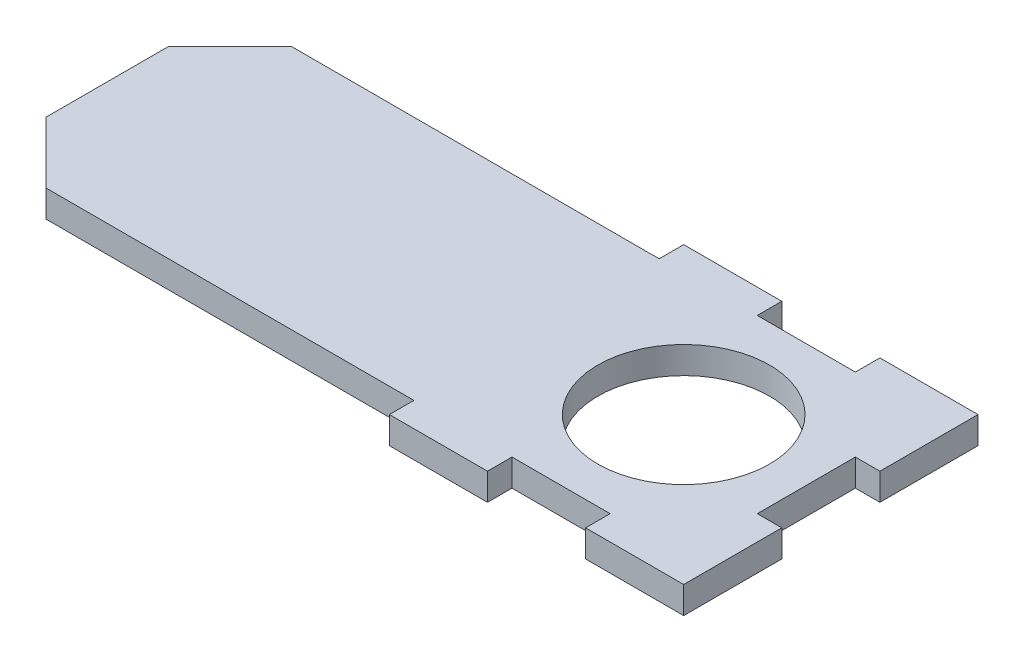
ISO-10303-21;
HEADER;
FILE_DESCRIPTION(('STEP AP214'),'2;1');
FILE_NAME('part.step','',(''),(''),'','','');
FILE_SCHEMA(('AUTOMOTIVE_DESIGN { 1 0 10303 214 1 1 1 1 }'));
ENDSEC;
DATA;
#1=APPLICATION_CONTEXT('core data for automotive mechanical design processes');
#2=APPLICATION_PROTOCOL_DEFINITION('international standard','automotive_design',2000,#1);
#3=PRODUCT_CONTEXT('',#1,'mechanical');
#4=PRODUCT('Part','Part','',(#3));
#5=PRODUCT_RELATED_PRODUCT_CATEGORY('part','',(#4));
#6=PRODUCT_DEFINITION_FORMATION('','',#4);
#7=PRODUCT_DEFINITION_CONTEXT('part definition',#1,'design');
#8=PRODUCT_DEFINITION('design','',#6,#7);
#9=PRODUCT_DEFINITION_SHAPE('','',#8);
#10=(LENGTH_UNIT() NAMED_UNIT(*) SI_UNIT(.MILLI.,.METRE.));
#11=(NAMED_UNIT(*) PLANE_ANGLE_UNIT() SI_UNIT($,.RADIAN.));
#12=(NAMED_UNIT(*) SI_UNIT($,.STERADIAN.) SOLID_ANGLE_UNIT());
#13=UNCERTAINTY_MEASURE_WITH_UNIT(LENGTH_MEASURE(1.E-05),#10,'distance_accuracy_value','');
#14=(GEOMETRIC_REPRESENTATION_CONTEXT(3) GLOBAL_UNCERTAINTY_ASSIGNED_CONTEXT((#13)) GLOBAL_UNIT_ASSIGNED_CONTEXT((#10,
#11,#12)) REPRESENTATION_CONTEXT('',''));
#15=CARTESIAN_POINT('',(0.,0.,0.));
#16=DIRECTION('',(0.,0.,1.));
#17=DIRECTION('',(1.,0.,0.));
#18=AXIS2_PLACEMENT_3D('',#15,#16,#17);
#19=CARTESIAN_POINT('',(-161.731808477122,2.2,0.));
#20=DIRECTION('',(-1.,0.,0.));
#21=DIRECTION('',(0.,0.,1.));
#22=AXIS2_PLACEMENT_3D('',#19,#20,#21);
#23=PLANE('',#22);
#24=DIRECTION('',(0.,0.,-1.));
#25=VECTOR('',#24,1.);
#26=CARTESIAN_POINT('',(-161.731808477122,0.,0.));
#27=LINE('',#26,#25);
#28=CARTESIAN_POINT('',(-161.731808477122,0.,-9.59771271610144));
#29=VERTEX_POINT('',#28);
#30=CARTESIAN_POINT('',(-161.731808477122,0.,-11.5977127156621));
#31=VERTEX_POINT('',#30);
#32=EDGE_CURVE('E270',#29,#31,#27,.T.);
#33=ORIENTED_EDGE('',*,*,#32,.F.);
#34=DIRECTION('',(0.,-1.,0.));
#35=VECTOR('',#34,1.);
#36=CARTESIAN_POINT('',(-161.731808477122,2.2,-9.59771271610144));
#37=LINE('',#36,#35);
#38=CARTESIAN_POINT('',(-161.731808477122,2.2,-9.59771271610144));
#39=VERTEX_POINT('',#38);
#40=EDGE_CURVE('E11',#39,#29,#37,.T.);
#41=ORIENTED_EDGE('',*,*,#40,.F.);
#42=DIRECTION('',(0.,0.,-1.));
#43=VECTOR('',#42,1.);
#44=CARTESIAN_POINT('',(-161.731808477122,2.2,0.));
#45=LINE('',#44,#43);
#46=CARTESIAN_POINT('',(-161.731808477122,2.2,-11.5977127156621));
#47=VERTEX_POINT('',#46);
#48=EDGE_CURVE('E374',#39,#47,#45,.T.);
#49=ORIENTED_EDGE('',*,*,#48,.T.);
#50=DIRECTION('',(0.,-1.,0.));
#51=VECTOR('',#50,1.);
#52=CARTESIAN_POINT('',(-161.731808477122,2.2,-11.5977127156621));
#53=LINE('',#52,#51);
#54=EDGE_CURVE('E130',#47,#31,#53,.T.);
#55=ORIENTED_EDGE('',*,*,#54,.T.);
#56=EDGE_LOOP('',(#33,#41,#49,#55));
#57=FACE_BOUND('',#56,.T.);
#58=ADVANCED_FACE('F37',(#57),#23,.T.);
#59=CARTESIAN_POINT('',(0.,2.2,-9.59771271610144));
#60=DIRECTION('',(0.,0.,-1.));
#61=DIRECTION('',(-1.,0.,0.));
#62=AXIS2_PLACEMENT_3D('',#59,#60,#61);
#63=PLANE('',#62);
#64=DIRECTION('',(1.,0.,0.));
#65=VECTOR('',#64,1.);
#66=CARTESIAN_POINT('',(0.,0.,-9.59771271610144));
#67=LINE('',#66,#65);
#68=CARTESIAN_POINT('',(-191.731808477096,0.,-9.59771271610144));
#69=VERTEX_POINT('',#68);
#70=EDGE_CURVE('E268',#69,#29,#67,.T.);
#71=ORIENTED_EDGE('',*,*,#70,.F.);
#72=DIRECTION('',(0.,-1.,0.));
#73=VECTOR('',#72,1.);
#74=CARTESIAN_POINT('',(-191.731808477096,2.2,-9.59771271610144));
#75=LINE('',#74,#73);
#76=CARTESIAN_POINT('',(-191.731808477096,2.2,-9.59771271610144));
#77=VERTEX_POINT('',#76);
#78=EDGE_CURVE('E46',#77,#69,#75,.T.);
#79=ORIENTED_EDGE('',*,*,#78,.F.);
#80=DIRECTION('',(1.,0.,0.));
#81=VECTOR('',#80,1.);
#82=CARTESIAN_POINT('',(0.,2.2,-9.59771271610144));
#83=LINE('',#82,#81);
#84=EDGE_CURVE('E372',#77,#39,#83,.T.);
#85=ORIENTED_EDGE('',*,*,#84,.T.);
#86=ORIENTED_EDGE('',*,*,#40,.T.);
#87=EDGE_LOOP('',(#71,#79,#85,#86));
#88=FACE_BOUND('',#87,.T.);
#89=ADVANCED_FACE('F269',(#88),#63,.T.);
#90=CARTESIAN_POINT('',(-100.664760596598,2.2,-100.664760596599));
#91=DIRECTION('',(-0.707106781186545,0.,-0.70710678118655));
#92=DIRECTION('',(-0.70710678118655,0.,0.707106781186545));
#93=AXIS2_PLACEMENT_3D('',#90,#91,#92);
#94=PLANE('',#93);
#95=DIRECTION('',(0.70710678118655,0.,-0.707106781186545));
#96=VECTOR('',#95,1.);
#97=CARTESIAN_POINT('',(-100.664760596598,0.,-100.664760596599));
#98=LINE('',#97,#96);
#99=CARTESIAN_POINT('',(-196.731808477118,0.,-4.59771271607949));
#100=VERTEX_POINT('',#99);
#101=EDGE_CURVE('E260',#100,#69,#98,.T.);
#102=ORIENTED_EDGE('',*,*,#101,.F.);
#103=DIRECTION('',(0.,-1.,0.));
#104=VECTOR('',#103,1.);
#105=CARTESIAN_POINT('',(-196.731808477118,2.2,-4.59771271607949));
#106=LINE('',#105,#104);
#107=CARTESIAN_POINT('',(-196.731808477118,2.2,-4.59771271607949));
#108=VERTEX_POINT('',#107);
#109=EDGE_CURVE('E253',#108,#100,#106,.T.);
#110=ORIENTED_EDGE('',*,*,#109,.F.);
#111=DIRECTION('',(0.70710678118655,0.,-0.707106781186545));
#112=VECTOR('',#111,1.);
#113=CARTESIAN_POINT('',(-100.664760596598,2.2,-100.664760596599));
#114=LINE('',#113,#112);
#115=EDGE_CURVE('E263',#108,#77,#114,.T.);
#116=ORIENTED_EDGE('',*,*,#115,.T.);
#117=ORIENTED_EDGE('',*,*,#78,.T.);
#118=EDGE_LOOP('',(#102,#110,#116,#117));
#119=FACE_BOUND('',#118,.T.);
#120=ADVANCED_FACE('F258',(#119),#94,.T.);
#121=CARTESIAN_POINT('',(-196.731808477118,2.2,0.));
#122=DIRECTION('',(-1.,0.,0.));
#123=DIRECTION('',(0.,0.,1.));
#124=AXIS2_PLACEMENT_3D('',#121,#122,#123);
#125=PLANE('',#124);
#126=DIRECTION('',(0.,0.,-1.));
#127=VECTOR('',#126,1.);
#128=CARTESIAN_POINT('',(-196.731808477118,0.,0.));
#129=LINE('',#128,#127);
#130=CARTESIAN_POINT('',(-196.731808477118,0.,5.40228728413635));
#131=VERTEX_POINT('',#130);
#132=EDGE_CURVE('E275',#131,#100,#129,.T.);
#133=ORIENTED_EDGE('',*,*,#132,.F.);
#134=DIRECTION('',(0.,-1.,0.));
#135=VECTOR('',#134,1.);
#136=CARTESIAN_POINT('',(-196.731808477118,2.2,5.40228728413635));
#137=LINE('',#136,#135);
#138=CARTESIAN_POINT('',(-196.731808477118,2.2,5.40228728413635));
#139=VERTEX_POINT('',#138);
#140=EDGE_CURVE('E251',#139,#131,#137,.T.);
#141=ORIENTED_EDGE('',*,*,#140,.F.);
#142=DIRECTION('',(0.,0.,-1.));
#143=VECTOR('',#142,1.);
#144=CARTESIAN_POINT('',(-196.731808477118,2.2,0.));
#145=LINE('',#144,#143);
#146=EDGE_CURVE('E368',#139,#108,#145,.T.);
#147=ORIENTED_EDGE('',*,*,#146,.T.);
#148=ORIENTED_EDGE('',*,*,#109,.T.);
#149=EDGE_LOOP('',(#133,#141,#147,#148));
#150=FACE_BOUND('',#149,.T.);
#151=ADVANCED_FACE('F404',(#150),#125,.T.);
#152=CARTESIAN_POINT('',(-101.067047880627,2.2,101.067047880627));
#153=DIRECTION('',(-0.707106781186547,0.,0.707106781186548));
#154=DIRECTION('',(0.707106781186548,0.,0.707106781186547));
#155=AXIS2_PLACEMENT_3D('',#152,#153,#154);
#156=PLANE('',#155);
#157=DIRECTION('',(-0.707106781186548,0.,-0.707106781186547));
#158=VECTOR('',#157,1.);
#159=CARTESIAN_POINT('',(-101.067047880627,0.,101.067047880627));
#160=LINE('',#159,#158);
#161=CARTESIAN_POINT('',(-191.731808477118,0.,10.4022872841364));
#162=VERTEX_POINT('',#161);
#163=EDGE_CURVE('E277',#162,#131,#160,.T.);
#164=ORIENTED_EDGE('',*,*,#163,.F.);
#165=DIRECTION('',(0.,-1.,0.));
#166=VECTOR('',#165,1.);
#167=CARTESIAN_POINT('',(-191.731808477118,2.2,10.4022872841364));
#168=LINE('',#167,#166);
#169=CARTESIAN_POINT('',(-191.731808477118,2.2,10.4022872841364));
#170=VERTEX_POINT('',#169);
#171=EDGE_CURVE('E249',#170,#162,#168,.T.);
#172=ORIENTED_EDGE('',*,*,#171,.F.);
#173=DIRECTION('',(-0.707106781186548,0.,-0.707106781186547));
#174=VECTOR('',#173,1.);
#175=CARTESIAN_POINT('',(-101.067047880627,2.2,101.067047880627));
#176=LINE('',#175,#174);
#177=EDGE_CURVE('E363',#170,#139,#176,.T.);
#178=ORIENTED_EDGE('',*,*,#177,.T.);
#179=ORIENTED_EDGE('',*,*,#140,.T.);
#180=EDGE_LOOP('',(#164,#172,#178,#179));
#181=FACE_BOUND('',#180,.T.);
#182=ADVANCED_FACE('F407',(#181),#156,.T.);
#183=CARTESIAN_POINT('',(0.,2.2,10.4022872841364));
#184=DIRECTION('',(0.,0.,-1.));
#185=DIRECTION('',(-1.,0.,0.));
#186=AXIS2_PLACEMENT_3D('',#183,#184,#185);
#187=PLANE('',#186);
#188=DIRECTION('',(1.,0.,0.));
#189=VECTOR('',#188,1.);
#190=CARTESIAN_POINT('',(0.,0.,10.4022872841364));
#191=LINE('',#190,#189);
#192=CARTESIAN_POINT('',(-161.731808477122,0.,10.4022872841364));
#193=VERTEX_POINT('',#192);
#194=EDGE_CURVE('E282',#162,#193,#191,.T.);
#195=ORIENTED_EDGE('',*,*,#194,.T.);
#196=DIRECTION('',(0.,-1.,0.));
#197=VECTOR('',#196,1.);
#198=CARTESIAN_POINT('',(-161.731808477122,2.2,10.4022872841364));
#199=LINE('',#198,#197);
#200=CARTESIAN_POINT('',(-161.731808477122,2.2,10.4022872841364));
#201=VERTEX_POINT('',#200);
#202=EDGE_CURVE('E247',#201,#193,#199,.T.);
#203=ORIENTED_EDGE('',*,*,#202,.F.);
#204=DIRECTION('',(1.,0.,0.));
#205=VECTOR('',#204,1.);
#206=CARTESIAN_POINT('',(0.,2.2,10.4022872841364));
#207=LINE('',#206,#205);
#208=EDGE_CURVE('E360',#170,#201,#207,.T.);
#209=ORIENTED_EDGE('',*,*,#208,.F.);
#210=ORIENTED_EDGE('',*,*,#171,.T.);
#211=EDGE_LOOP('',(#195,#203,#209,#210));
#212=FACE_BOUND('',#211,.T.);
#213=ADVANCED_FACE('F411',(#212),#187,.F.);
#214=CARTESIAN_POINT('',(-161.731808477122,2.2,0.));
#215=DIRECTION('',(-1.,0.,0.));
#216=DIRECTION('',(0.,0.,1.));
#217=AXIS2_PLACEMENT_3D('',#214,#215,#216);
#218=PLANE('',#217);
#219=DIRECTION('',(0.,0.,-1.));
#220=VECTOR('',#219,1.);
#221=CARTESIAN_POINT('',(-161.731808477122,0.,0.));
#222=LINE('',#221,#220);
#223=CARTESIAN_POINT('',(-161.731808477122,0.,12.4022872843402));
#224=VERTEX_POINT('',#223);
#225=EDGE_CURVE('E285',#224,#193,#222,.T.);
#226=ORIENTED_EDGE('',*,*,#225,.F.);
#227=DIRECTION('',(0.,-1.,0.));
#228=VECTOR('',#227,1.);
#229=CARTESIAN_POINT('',(-161.731808477122,2.2,12.4022872843402));
#230=LINE('',#229,#228);
#231=CARTESIAN_POINT('',(-161.731808477122,2.2,12.4022872843402));
#232=VERTEX_POINT('',#231);
#233=EDGE_CURVE('E245',#232,#224,#230,.T.);
#234=ORIENTED_EDGE('',*,*,#233,.F.);
#235=DIRECTION('',(0.,0.,-1.));
#236=VECTOR('',#235,1.);
#237=CARTESIAN_POINT('',(-161.731808477122,2.2,0.));
#238=LINE('',#237,#236);
#239=EDGE_CURVE('E355',#232,#201,#238,.T.);
#240=ORIENTED_EDGE('',*,*,#239,.T.);
#241=ORIENTED_EDGE('',*,*,#202,.T.);
#242=EDGE_LOOP('',(#226,#234,#240,#241));
#243=FACE_BOUND('',#242,.T.);
#244=ADVANCED_FACE('F415',(#243),#218,.T.);
#245=CARTESIAN_POINT('',(0.,2.2,12.4022872843402));
#246=DIRECTION('',(0.,0.,1.));
#247=DIRECTION('',(1.,0.,0.));
#248=AXIS2_PLACEMENT_3D('',#245,#246,#247);
#249=PLANE('',#248);
#250=DIRECTION('',(-1.,0.,0.));
#251=VECTOR('',#250,1.);
#252=CARTESIAN_POINT('',(0.,0.,12.4022872843402));
#253=LINE('',#252,#251);
#254=CARTESIAN_POINT('',(-153.731808477115,0.,12.4022872843402));
#255=VERTEX_POINT('',#254);
#256=EDGE_CURVE('E288',#255,#224,#253,.T.);
#257=ORIENTED_EDGE('',*,*,#256,.F.);
#258=DIRECTION('',(0.,-1.,0.));
#259=VECTOR('',#258,1.);
#260=CARTESIAN_POINT('',(-153.731808477115,2.2,12.4022872843402));
#261=LINE('',#260,#259);
#262=CARTESIAN_POINT('',(-153.731808477115,2.2,12.4022872843402));
#263=VERTEX_POINT('',#262);
#264=EDGE_CURVE('E243',#263,#255,#261,.T.);
#265=ORIENTED_EDGE('',*,*,#264,.F.);
#266=DIRECTION('',(-1.,0.,0.));
#267=VECTOR('',#266,1.);
#268=CARTESIAN_POINT('',(0.,2.2,12.4022872843402));
#269=LINE('',#268,#267);
#270=EDGE_CURVE('E347',#263,#232,#269,.T.);
#271=ORIENTED_EDGE('',*,*,#270,.T.);
#272=ORIENTED_EDGE('',*,*,#233,.T.);
#273=EDGE_LOOP('',(#257,#265,#271,#272));
#274=FACE_BOUND('',#273,.T.);
#275=ADVANCED_FACE('F419',(#274),#249,.T.);
#276=CARTESIAN_POINT('',(-153.731808477115,2.2,-4.266914834714E-12));
#277=DIRECTION('',(1.,0.,0.));
#278=DIRECTION('',(0.,0.,-1.));
#279=AXIS2_PLACEMENT_3D('',#276,#277,#278);
#280=PLANE('',#279);
#281=DIRECTION('',(0.,0.,1.));
#282=VECTOR('',#281,1.);
#283=CARTESIAN_POINT('',(-153.731808477115,0.,-4.266914834714E-12));
#284=LINE('',#283,#282);
#285=CARTESIAN_POINT('',(-153.731808477115,0.,10.4022872843314));
#286=VERTEX_POINT('',#285);
#287=EDGE_CURVE('E291',#286,#255,#284,.T.);
#288=ORIENTED_EDGE('',*,*,#287,.F.);
#289=DIRECTION('',(0.,-1.,0.));
#290=VECTOR('',#289,1.);
#291=CARTESIAN_POINT('',(-153.731808477115,2.2,10.4022872843314));
#292=LINE('',#291,#290);
#293=CARTESIAN_POINT('',(-153.731808477115,2.2,10.4022872843314));
#294=VERTEX_POINT('',#293);
#295=EDGE_CURVE('E241',#294,#286,#292,.T.);
#296=ORIENTED_EDGE('',*,*,#295,.F.);
#297=DIRECTION('',(0.,0.,1.));
#298=VECTOR('',#297,1.);
#299=CARTESIAN_POINT('',(-153.731808477115,2.2,-4.266914834714E-12));
#300=LINE('',#299,#298);
#301=EDGE_CURVE('E354',#294,#263,#300,.T.);
#302=ORIENTED_EDGE('',*,*,#301,.T.);
#303=ORIENTED_EDGE('',*,*,#264,.T.);
#304=EDGE_LOOP('',(#288,#296,#302,#303));
#305=FACE_BOUND('',#304,.T.);
#306=ADVANCED_FACE('F420',(#305),#280,.T.);
#307=CARTESIAN_POINT('',(-1.44360735647907E-13,2.2,10.4022872843335));
#308=DIRECTION('',(0.,0.,1.));
#309=DIRECTION('',(1.,0.,0.));
#310=AXIS2_PLACEMENT_3D('',#307,#308,#309);
#311=PLANE('',#310);
#312=DIRECTION('',(-1.,0.,0.));
#313=VECTOR('',#312,1.);
#314=CARTESIAN_POINT('',(-1.44360735647907E-13,0.,10.4022872843335));
#315=LINE('',#314,#313);
#316=CARTESIAN_POINT('',(-145.731808477115,0.,10.4022872843315));
#317=VERTEX_POINT('',#316);
#318=EDGE_CURVE('E295',#317,#286,#315,.T.);
#319=ORIENTED_EDGE('',*,*,#318,.F.);
#320=DIRECTION('',(0.,-1.,0.));
#321=VECTOR('',#320,1.);
#322=CARTESIAN_POINT('',(-145.731808477115,2.2,10.4022872843315));
#323=LINE('',#322,#321);
#324=CARTESIAN_POINT('',(-145.731808477115,2.2,10.4022872843315));
#325=VERTEX_POINT('',#324);
#326=EDGE_CURVE('E239',#325,#317,#323,.T.);
#327=ORIENTED_EDGE('',*,*,#326,.F.);
#328=DIRECTION('',(-1.,0.,0.));
#329=VECTOR('',#328,1.);
#330=CARTESIAN_POINT('',(-1.44360735647907E-13,2.2,10.4022872843335));
#331=LINE('',#330,#329);
#332=EDGE_CURVE('E350',#325,#294,#331,.T.);
#333=ORIENTED_EDGE('',*,*,#332,.T.);
#334=ORIENTED_EDGE('',*,*,#295,.T.);
#335=EDGE_LOOP('',(#319,#327,#333,#334));
#336=FACE_BOUND('',#335,.T.);
#337=ADVANCED_FACE('F423',(#336),#311,.T.);
#338=CARTESIAN_POINT('',(-145.731808477115,2.2,-4.04487022978891E-12));
#339=DIRECTION('',(-1.,0.,0.));
#340=DIRECTION('',(0.,0.,1.));
#341=AXIS2_PLACEMENT_3D('',#338,#339,#340);
#342=PLANE('',#341);
#343=DIRECTION('',(0.,0.,-1.));
#344=VECTOR('',#343,1.);
#345=CARTESIAN_POINT('',(-145.731808477115,0.,-4.04487022978891E-12));
#346=LINE('',#345,#344);
#347=CARTESIAN_POINT('',(-145.731808477115,0.,12.4022872843402));
#348=VERTEX_POINT('',#347);
#349=EDGE_CURVE('E298',#348,#317,#346,.T.);
#350=ORIENTED_EDGE('',*,*,#349,.F.);
#351=DIRECTION('',(0.,-1.,0.));
#352=VECTOR('',#351,1.);
#353=CARTESIAN_POINT('',(-145.731808477115,2.2,12.4022872843402));
#354=LINE('',#353,#352);
#355=CARTESIAN_POINT('',(-145.731808477115,2.2,12.4022872843402));
#356=VERTEX_POINT('',#355);
#357=EDGE_CURVE('E237',#356,#348,#354,.T.);
#358=ORIENTED_EDGE('',*,*,#357,.F.);
#359=DIRECTION('',(0.,0.,-1.));
#360=VECTOR('',#359,1.);
#361=CARTESIAN_POINT('',(-145.731808477115,2.2,-4.04487022978891E-12));
#362=LINE('',#361,#360);
#363=EDGE_CURVE('E345',#356,#325,#362,.T.);
#364=ORIENTED_EDGE('',*,*,#363,.T.);
#365=ORIENTED_EDGE('',*,*,#326,.T.);
#366=EDGE_LOOP('',(#350,#358,#364,#365));
#367=FACE_BOUND('',#366,.T.);
#368=ADVANCED_FACE('F427',(#367),#342,.T.);
#369=CARTESIAN_POINT('',(-137.731808477107,0.,12.4022872843402));
#370=VERTEX_POINT('',#369);
#371=EDGE_CURVE('E292',#370,#348,#253,.T.);
#372=ORIENTED_EDGE('',*,*,#371,.F.);
#373=DIRECTION('',(0.,-1.,0.));
#374=VECTOR('',#373,1.);
#375=CARTESIAN_POINT('',(-137.731808477107,2.2,12.4022872843402));
#376=LINE('',#375,#374);
#377=CARTESIAN_POINT('',(-137.731808477107,2.2,12.4022872843402));
#378=VERTEX_POINT('',#377);
#379=EDGE_CURVE('E235',#378,#370,#376,.T.);
#380=ORIENTED_EDGE('',*,*,#379,.F.);
#381=EDGE_CURVE('E339',#378,#356,#269,.T.);
#382=ORIENTED_EDGE('',*,*,#381,.T.);
#383=ORIENTED_EDGE('',*,*,#357,.T.);
#384=EDGE_LOOP('',(#372,#380,#382,#383));
#385=FACE_BOUND('',#384,.T.);
#386=ADVANCED_FACE('F431',(#385),#249,.T.);
#387=CARTESIAN_POINT('',(-137.731808477107,2.2,0.));
#388=DIRECTION('',(-1.,0.,0.));
#389=DIRECTION('',(0.,0.,1.));
#390=AXIS2_PLACEMENT_3D('',#387,#388,#389);
#391=PLANE('',#390);
#392=DIRECTION('',(0.,0.,-1.));
#393=VECTOR('',#392,1.);
#394=CARTESIAN_POINT('',(-137.731808477107,0.,0.));
#395=LINE('',#394,#393);
#396=CARTESIAN_POINT('',(-137.731808477107,0.,4.40228728433163));
#397=VERTEX_POINT('',#396);
#398=EDGE_CURVE('E301',#370,#397,#395,.T.);
#399=ORIENTED_EDGE('',*,*,#398,.T.);
#400=DIRECTION('',(0.,-1.,0.));
#401=VECTOR('',#400,1.);
#402=CARTESIAN_POINT('',(-137.731808477107,2.2,4.40228728433163));
#403=LINE('',#402,#401);
#404=CARTESIAN_POINT('',(-137.731808477107,2.2,4.40228728433163));
#405=VERTEX_POINT('',#404);
#406=EDGE_CURVE('E232',#405,#397,#403,.T.);
#407=ORIENTED_EDGE('',*,*,#406,.F.);
#408=DIRECTION('',(0.,0.,-1.));
#409=VECTOR('',#408,1.);
#410=CARTESIAN_POINT('',(-137.731808477107,2.2,0.));
#411=LINE('',#410,#409);
#412=EDGE_CURVE('E331',#378,#405,#411,.T.);
#413=ORIENTED_EDGE('',*,*,#412,.F.);
#414=ORIENTED_EDGE('',*,*,#379,.T.);
#415=EDGE_LOOP('',(#399,#407,#413,#414));
#416=FACE_BOUND('',#415,.T.);
#417=ADVANCED_FACE('F435',(#416),#391,.F.);
#418=CARTESIAN_POINT('',(-1.22188017602098E-13,2.2,4.40228728433546));
#419=DIRECTION('',(0.,0.,1.));
#420=DIRECTION('',(1.,0.,0.));
#421=AXIS2_PLACEMENT_3D('',#418,#419,#420);
#422=PLANE('',#421);
#423=DIRECTION('',(-1.,0.,0.));
#424=VECTOR('',#423,1.);
#425=CARTESIAN_POINT('',(-1.22188017602098E-13,0.,4.40228728433546));
#426=LINE('',#425,#424);
#427=CARTESIAN_POINT('',(-139.731808477115,0.,4.40228728433158));
#428=VERTEX_POINT('',#427);
#429=EDGE_CURVE('E304',#397,#428,#426,.T.);
#430=ORIENTED_EDGE('',*,*,#429,.T.);
#431=DIRECTION('',(0.,-1.,0.));
#432=VECTOR('',#431,1.);
#433=CARTESIAN_POINT('',(-139.731808477115,2.2,4.40228728433158));
#434=LINE('',#433,#432);
#435=CARTESIAN_POINT('',(-139.731808477115,2.2,4.40228728433158));
#436=VERTEX_POINT('',#435);
#437=EDGE_CURVE('E229',#436,#428,#434,.T.);
#438=ORIENTED_EDGE('',*,*,#437,.F.);
#439=DIRECTION('',(-1.,0.,0.));
#440=VECTOR('',#439,1.);
#441=CARTESIAN_POINT('',(-1.22188017602098E-13,2.2,4.40228728433546));
#442=LINE('',#441,#440);
#443=EDGE_CURVE('E338',#405,#436,#442,.T.);
#444=ORIENTED_EDGE('',*,*,#443,.F.);
#445=ORIENTED_EDGE('',*,*,#406,.T.);
#446=EDGE_LOOP('',(#430,#438,#444,#445));
#447=FACE_BOUND('',#446,.T.);
#448=ADVANCED_FACE('F436',(#447),#422,.F.);
#449=CARTESIAN_POINT('',(-139.731808477115,2.2,-1.93916838804757E-12));
#450=DIRECTION('',(-1.,0.,0.));
#451=DIRECTION('',(0.,0.,1.));
#452=AXIS2_PLACEMENT_3D('',#449,#450,#451);
#453=PLANE('',#452);
#454=DIRECTION('',(0.,0.,-1.));
#455=VECTOR('',#454,1.);
#456=CARTESIAN_POINT('',(-139.731808477115,0.,-1.93916838804757E-12));
#457=LINE('',#456,#455);
#458=CARTESIAN_POINT('',(-139.731808477115,0.,-3.59771271566843));
#459=VERTEX_POINT('',#458);
#460=EDGE_CURVE('E308',#428,#459,#457,.T.);
#461=ORIENTED_EDGE('',*,*,#460,.T.);
#462=DIRECTION('',(0.,-1.,0.));
#463=VECTOR('',#462,1.);
#464=CARTESIAN_POINT('',(-139.731808477115,2.2,-3.59771271566843));
#465=LINE('',#464,#463);
#466=CARTESIAN_POINT('',(-139.731808477115,2.2,-3.59771271566843));
#467=VERTEX_POINT('',#466);
#468=EDGE_CURVE('E226',#467,#459,#465,.T.);
#469=ORIENTED_EDGE('',*,*,#468,.F.);
#470=DIRECTION('',(0.,0.,-1.));
#471=VECTOR('',#470,1.);
#472=CARTESIAN_POINT('',(-139.731808477115,2.2,-1.93916838804757E-12));
#473=LINE('',#472,#471);
#474=EDGE_CURVE('E334',#436,#467,#473,.T.);
#475=ORIENTED_EDGE('',*,*,#474,.F.);
#476=ORIENTED_EDGE('',*,*,#437,.T.);
#477=EDGE_LOOP('',(#461,#469,#475,#476));
#478=FACE_BOUND('',#477,.T.);
#479=ADVANCED_FACE('F439',(#478),#453,.F.);
#480=CARTESIAN_POINT('',(0.,2.2,-3.59771271566843));
#481=DIRECTION('',(0.,0.,-1.));
#482=DIRECTION('',(-1.,0.,0.));
#483=AXIS2_PLACEMENT_3D('',#480,#481,#482);
#484=PLANE('',#483);
#485=DIRECTION('',(1.,0.,0.));
#486=VECTOR('',#485,1.);
#487=CARTESIAN_POINT('',(0.,0.,-3.59771271566843));
#488=LINE('',#487,#486);
#489=CARTESIAN_POINT('',(-137.731808477107,0.,-3.59771271566843));
#490=VERTEX_POINT('',#489);
#491=EDGE_CURVE('E311',#459,#490,#488,.T.);
#492=ORIENTED_EDGE('',*,*,#491,.T.);
#493=DIRECTION('',(0.,-1.,0.));
#494=VECTOR('',#493,1.);
#495=CARTESIAN_POINT('',(-137.731808477107,2.2,-3.59771271566843));
#496=LINE('',#495,#494);
#497=CARTESIAN_POINT('',(-137.731808477107,2.2,-3.59771271566843));
#498=VERTEX_POINT('',#497);
#499=EDGE_CURVE('E223',#498,#490,#496,.T.);
#500=ORIENTED_EDGE('',*,*,#499,.F.);
#501=DIRECTION('',(1.,0.,0.));
#502=VECTOR('',#501,1.);
#503=CARTESIAN_POINT('',(0.,2.2,-3.59771271566843));
#504=LINE('',#503,#502);
#505=EDGE_CURVE('E329',#467,#498,#504,.T.);
#506=ORIENTED_EDGE('',*,*,#505,.F.);
#507=ORIENTED_EDGE('',*,*,#468,.T.);
#508=EDGE_LOOP('',(#492,#500,#506,#507));
#509=FACE_BOUND('',#508,.T.);
#510=ADVANCED_FACE('F443',(#509),#484,.F.);
#511=CARTESIAN_POINT('',(-137.731808477107,0.,-11.5977127156621));
#512=VERTEX_POINT('',#511);
#513=EDGE_CURVE('E305',#490,#512,#395,.T.);
#514=ORIENTED_EDGE('',*,*,#513,.T.);
#515=DIRECTION('',(0.,-1.,0.));
#516=VECTOR('',#515,1.);
#517=CARTESIAN_POINT('',(-137.731808477107,2.2,-11.5977127156621));
#518=LINE('',#517,#516);
#519=CARTESIAN_POINT('',(-137.731808477107,2.2,-11.5977127156621));
#520=VERTEX_POINT('',#519);
#521=EDGE_CURVE('E220',#520,#512,#518,.T.);
#522=ORIENTED_EDGE('',*,*,#521,.F.);
#523=EDGE_CURVE('E326',#498,#520,#411,.T.);
#524=ORIENTED_EDGE('',*,*,#523,.F.);
#525=ORIENTED_EDGE('',*,*,#499,.T.);
#526=EDGE_LOOP('',(#514,#522,#524,#525));
#527=FACE_BOUND('',#526,.T.);
#528=ADVANCED_FACE('F447',(#527),#391,.F.);
#529=CARTESIAN_POINT('',(0.,2.2,-11.5977127156621));
#530=DIRECTION('',(0.,0.,1.));
#531=DIRECTION('',(1.,0.,0.));
#532=AXIS2_PLACEMENT_3D('',#529,#530,#531);
#533=PLANE('',#532);
#534=DIRECTION('',(-1.,0.,0.));
#535=VECTOR('',#534,1.);
#536=CARTESIAN_POINT('',(0.,0.,-11.5977127156621));
#537=LINE('',#536,#535);
#538=CARTESIAN_POINT('',(-145.731808477115,0.,-11.5977127156621));
#539=VERTEX_POINT('',#538);
#540=EDGE_CURVE('E314',#512,#539,#537,.T.);
#541=ORIENTED_EDGE('',*,*,#540,.T.);
#542=DIRECTION('',(0.,-1.,0.));
#543=VECTOR('',#542,1.);
#544=CARTESIAN_POINT('',(-145.731808477115,2.2,-11.5977127156621));
#545=LINE('',#544,#543);
#546=CARTESIAN_POINT('',(-145.731808477115,2.2,-11.5977127156621));
#547=VERTEX_POINT('',#546);
#548=EDGE_CURVE('E213',#547,#539,#545,.T.);
#549=ORIENTED_EDGE('',*,*,#548,.F.);
#550=DIRECTION('',(-1.,0.,0.));
#551=VECTOR('',#550,1.);
#552=CARTESIAN_POINT('',(0.,2.2,-11.5977127156621));
#553=LINE('',#552,#551);
#554=EDGE_CURVE('E323',#520,#547,#553,.T.);
#555=ORIENTED_EDGE('',*,*,#554,.F.);
#556=ORIENTED_EDGE('',*,*,#521,.T.);
#557=EDGE_LOOP('',(#541,#549,#555,#556));
#558=FACE_BOUND('',#557,.T.);
#559=ADVANCED_FACE('F394',(#558),#533,.F.);
#560=CARTESIAN_POINT('',(-145.731808477115,2.2,0.));
#561=DIRECTION('',(1.,0.,0.));
#562=DIRECTION('',(0.,0.,-1.));
#563=AXIS2_PLACEMENT_3D('',#560,#561,#562);
#564=PLANE('',#563);
#565=DIRECTION('',(0.,0.,1.));
#566=VECTOR('',#565,1.);
#567=CARTESIAN_POINT('',(-145.731808477115,0.,0.));
#568=LINE('',#567,#566);
#569=CARTESIAN_POINT('',(-145.731808477115,0.,-9.59771271566855));
#570=VERTEX_POINT('',#569);
#571=EDGE_CURVE('E317',#539,#570,#568,.T.);
#572=ORIENTED_EDGE('',*,*,#571,.T.);
#573=DIRECTION('',(0.,-1.,0.));
#574=VECTOR('',#573,1.);
#575=CARTESIAN_POINT('',(-145.731808477115,2.2,-9.59771271566855));
#576=LINE('',#575,#574);
#577=CARTESIAN_POINT('',(-145.731808477115,2.2,-9.59771271566855));
#578=VERTEX_POINT('',#577);
#579=EDGE_CURVE('E211',#578,#570,#576,.T.);
#580=ORIENTED_EDGE('',*,*,#579,.F.);
#581=DIRECTION('',(0.,0.,1.));
#582=VECTOR('',#581,1.);
#583=CARTESIAN_POINT('',(-145.731808477115,2.2,0.));
#584=LINE('',#583,#582);
#585=EDGE_CURVE('E204',#547,#578,#584,.T.);
#586=ORIENTED_EDGE('',*,*,#585,.F.);
#587=ORIENTED_EDGE('',*,*,#548,.T.);
#588=EDGE_LOOP('',(#572,#580,#586,#587));
#589=FACE_BOUND('',#588,.T.);
#590=ADVANCED_FACE('F452',(#589),#564,.F.);
#591=CARTESIAN_POINT('',(1.33195020508383E-13,2.2,-9.59771271566652));
#592=DIRECTION('',(0.,0.,1.));
#593=DIRECTION('',(1.,0.,0.));
#594=AXIS2_PLACEMENT_3D('',#591,#592,#593);
#595=PLANE('',#594);
#596=DIRECTION('',(-1.,0.,0.));
#597=VECTOR('',#596,1.);
#598=CARTESIAN_POINT('',(1.33195020508383E-13,0.,-9.59771271566652));
#599=LINE('',#598,#597);
#600=CARTESIAN_POINT('',(-153.731808477115,0.,-9.59771271566866));
#601=VERTEX_POINT('',#600);
#602=EDGE_CURVE('E210',#570,#601,#599,.T.);
#603=ORIENTED_EDGE('',*,*,#602,.T.);
#604=DIRECTION('',(0.,-1.,0.));
#605=VECTOR('',#604,1.);
#606=CARTESIAN_POINT('',(-153.731808477115,2.2,-9.59771271566866));
#607=LINE('',#606,#605);
#608=CARTESIAN_POINT('',(-153.731808477115,2.2,-9.59771271566866));
#609=VERTEX_POINT('',#608);
#610=EDGE_CURVE('E196',#609,#601,#607,.T.);
#611=ORIENTED_EDGE('',*,*,#610,.F.);
#612=DIRECTION('',(-1.,0.,0.));
#613=VECTOR('',#612,1.);
#614=CARTESIAN_POINT('',(1.33195020508383E-13,2.2,-9.59771271566652));
#615=LINE('',#614,#613);
#616=EDGE_CURVE('E199',#578,#609,#615,.T.);
#617=ORIENTED_EDGE('',*,*,#616,.F.);
#618=ORIENTED_EDGE('',*,*,#579,.T.);
#619=EDGE_LOOP('',(#603,#611,#617,#618));
#620=FACE_BOUND('',#619,.T.);
#621=ADVANCED_FACE('F209',(#620),#595,.F.);
#622=CARTESIAN_POINT('',(-153.731808477115,2.2,0.));
#623=DIRECTION('',(-1.,0.,0.));
#624=DIRECTION('',(0.,0.,1.));
#625=AXIS2_PLACEMENT_3D('',#622,#623,#624);
#626=PLANE('',#625);
#627=DIRECTION('',(0.,0.,-1.));
#628=VECTOR('',#627,1.);
#629=CARTESIAN_POINT('',(-153.731808477115,0.,0.));
#630=LINE('',#629,#628);
#631=CARTESIAN_POINT('',(-153.731808477115,0.,-11.5977127156621));
#632=VERTEX_POINT('',#631);
#633=EDGE_CURVE('E321',#601,#632,#630,.T.);
#634=ORIENTED_EDGE('',*,*,#633,.T.);
#635=DIRECTION('',(0.,-1.,0.));
#636=VECTOR('',#635,1.);
#637=CARTESIAN_POINT('',(-153.731808477115,2.2,-11.5977127156621));
#638=LINE('',#637,#636);
#639=CARTESIAN_POINT('',(-153.731808477115,2.2,-11.5977127156621));
#640=VERTEX_POINT('',#639);
#641=EDGE_CURVE('E198',#640,#632,#638,.T.);
#642=ORIENTED_EDGE('',*,*,#641,.F.);
#643=DIRECTION('',(0.,0.,-1.));
#644=VECTOR('',#643,1.);
#645=CARTESIAN_POINT('',(-153.731808477115,2.2,0.));
#646=LINE('',#645,#644);
#647=EDGE_CURVE('E191',#609,#640,#646,.T.);
#648=ORIENTED_EDGE('',*,*,#647,.F.);
#649=ORIENTED_EDGE('',*,*,#610,.T.);
#650=EDGE_LOOP('',(#634,#642,#648,#649));
#651=FACE_BOUND('',#650,.T.);
#652=ADVANCED_FACE('F194',(#651),#626,.F.);
#653=CARTESIAN_POINT('',(-149.731808477125,2.2,0.402287284341121));
#654=DIRECTION('',(0.,-1.,0.));
#655=DIRECTION('',(0.,0.,-1.));
#656=AXIS2_PLACEMENT_3D('',#653,#654,#655);
#657=CYLINDRICAL_SURFACE('',#656,7.00000000000004);
#658=CARTESIAN_POINT('',(-149.731808477125,2.2,0.402287284341121));
#659=DIRECTION('',(0.,1.,0.));
#660=DIRECTION('',(0.,0.,1.));
#661=AXIS2_PLACEMENT_3D('',#658,#659,#660);
#662=CIRCLE('',#661,7.00000000000004);
#663=CARTESIAN_POINT('',(-149.731808477125,2.2,7.40228728434116));
#664=VERTEX_POINT('',#663);
#665=EDGE_CURVE('E376',#664,#664,#662,.T.);
#666=ORIENTED_EDGE('',*,*,#665,.T.);
#667=EDGE_LOOP('',(#666));
#668=FACE_BOUND('',#667,.T.);
#669=CARTESIAN_POINT('',(-149.731808477125,0.,0.402287284341121));
#670=DIRECTION('',(0.,1.,0.));
#671=DIRECTION('',(0.,0.,1.));
#672=AXIS2_PLACEMENT_3D('',#669,#670,#671);
#673=CIRCLE('',#672,7.00000000000004);
#674=CARTESIAN_POINT('',(-149.731808477125,0.,7.40228728434116));
#675=VERTEX_POINT('',#674);
#676=EDGE_CURVE('E382',#675,#675,#673,.T.);
#677=ORIENTED_EDGE('',*,*,#676,.F.);
#678=EDGE_LOOP('',(#677));
#679=FACE_BOUND('',#678,.T.);
#680=ADVANCED_FACE('F39',(#668,#679),#657,.F.);
#681=EDGE_CURVE('E123',#632,#31,#537,.T.);
#682=ORIENTED_EDGE('',*,*,#681,.T.);
#683=ORIENTED_EDGE('',*,*,#54,.F.);
#684=EDGE_CURVE('E54',#640,#47,#553,.T.);
#685=ORIENTED_EDGE('',*,*,#684,.F.);
#686=ORIENTED_EDGE('',*,*,#641,.T.);
#687=EDGE_LOOP('',(#682,#683,#685,#686));
#688=FACE_BOUND('',#687,.T.);
#689=ADVANCED_FACE('F381',(#688),#533,.F.);
#690=CARTESIAN_POINT('',(0.,2.2,0.));
#691=DIRECTION('',(0.,1.,0.));
#692=DIRECTION('',(0.,0.,1.));
#693=AXIS2_PLACEMENT_3D('',#690,#691,#692);
#694=PLANE('',#693);
#695=ORIENTED_EDGE('',*,*,#665,.F.);
#696=EDGE_LOOP('',(#695));
#697=FACE_BOUND('',#696,.T.);
#698=ORIENTED_EDGE('',*,*,#48,.F.);
#699=ORIENTED_EDGE('',*,*,#84,.F.);
#700=ORIENTED_EDGE('',*,*,#115,.F.);
#701=ORIENTED_EDGE('',*,*,#146,.F.);
#702=ORIENTED_EDGE('',*,*,#177,.F.);
#703=ORIENTED_EDGE('',*,*,#208,.T.);
#704=ORIENTED_EDGE('',*,*,#239,.F.);
#705=ORIENTED_EDGE('',*,*,#270,.F.);
#706=ORIENTED_EDGE('',*,*,#301,.F.);
#707=ORIENTED_EDGE('',*,*,#332,.F.);
#708=ORIENTED_EDGE('',*,*,#363,.F.);
#709=ORIENTED_EDGE('',*,*,#381,.F.);
#710=ORIENTED_EDGE('',*,*,#412,.T.);
#711=ORIENTED_EDGE('',*,*,#443,.T.);
#712=ORIENTED_EDGE('',*,*,#474,.T.);
#713=ORIENTED_EDGE('',*,*,#505,.T.);
#714=ORIENTED_EDGE('',*,*,#523,.T.);
#715=ORIENTED_EDGE('',*,*,#554,.T.);
#716=ORIENTED_EDGE('',*,*,#585,.T.);
#717=ORIENTED_EDGE('',*,*,#616,.T.);
#718=ORIENTED_EDGE('',*,*,#647,.T.);
#719=ORIENTED_EDGE('',*,*,#684,.T.);
#720=EDGE_LOOP('',(#698,#699,#700,#701,#702,#703,#704,#705,#706,#707,#708,#709,#710,#711,#712,
#713,#714,#715,#716,#717,#718,#719));
#721=FACE_BOUND('',#720,.T.);
#722=ADVANCED_FACE('F202',(#697,#721),#694,.T.);
#723=CARTESIAN_POINT('',(0.,0.,0.));
#724=DIRECTION('',(0.,1.,0.));
#725=DIRECTION('',(0.,0.,1.));
#726=AXIS2_PLACEMENT_3D('',#723,#724,#725);
#727=PLANE('',#726);
#728=ORIENTED_EDGE('',*,*,#676,.T.);
#729=EDGE_LOOP('',(#728));
#730=FACE_BOUND('',#729,.T.);
#731=ORIENTED_EDGE('',*,*,#32,.T.);
#732=ORIENTED_EDGE('',*,*,#681,.F.);
#733=ORIENTED_EDGE('',*,*,#633,.F.);
#734=ORIENTED_EDGE('',*,*,#602,.F.);
#735=ORIENTED_EDGE('',*,*,#571,.F.);
#736=ORIENTED_EDGE('',*,*,#540,.F.);
#737=ORIENTED_EDGE('',*,*,#513,.F.);
#738=ORIENTED_EDGE('',*,*,#491,.F.);
#739=ORIENTED_EDGE('',*,*,#460,.F.);
#740=ORIENTED_EDGE('',*,*,#429,.F.);
#741=ORIENTED_EDGE('',*,*,#398,.F.);
#742=ORIENTED_EDGE('',*,*,#371,.T.);
#743=ORIENTED_EDGE('',*,*,#349,.T.);
#744=ORIENTED_EDGE('',*,*,#318,.T.);
#745=ORIENTED_EDGE('',*,*,#287,.T.);
#746=ORIENTED_EDGE('',*,*,#256,.T.);
#747=ORIENTED_EDGE('',*,*,#225,.T.);
#748=ORIENTED_EDGE('',*,*,#194,.F.);
#749=ORIENTED_EDGE('',*,*,#163,.T.);
#750=ORIENTED_EDGE('',*,*,#132,.T.);
#751=ORIENTED_EDGE('',*,*,#101,.T.);
#752=ORIENTED_EDGE('',*,*,#70,.T.);
#753=EDGE_LOOP('',(#731,#732,#733,#734,#735,#736,#737,#738,#739,#740,#741,#742,#743,#744,#745,
#746,#747,#748,#749,#750,#751,#752));
#754=FACE_BOUND('',#753,.T.);
#755=ADVANCED_FACE('F272',(#730,#754),#727,.F.);
#756=CLOSED_SHELL('',(#58,#89,#120,#151,#182,#213,#244,#275,#306,#337,#368,#386,#417,#448,#479,
#510,#528,#559,#590,#621,#652,#680,#689,#722,#755));
#757=MANIFOLD_SOLID_BREP('B2',#756);
#758=ADVANCED_BREP_SHAPE_REPRESENTATION('',(#18,#757),#14);
#759=SHAPE_DEFINITION_REPRESENTATION(#9,#758);
ENDSEC;
END-ISO-10303-21;
